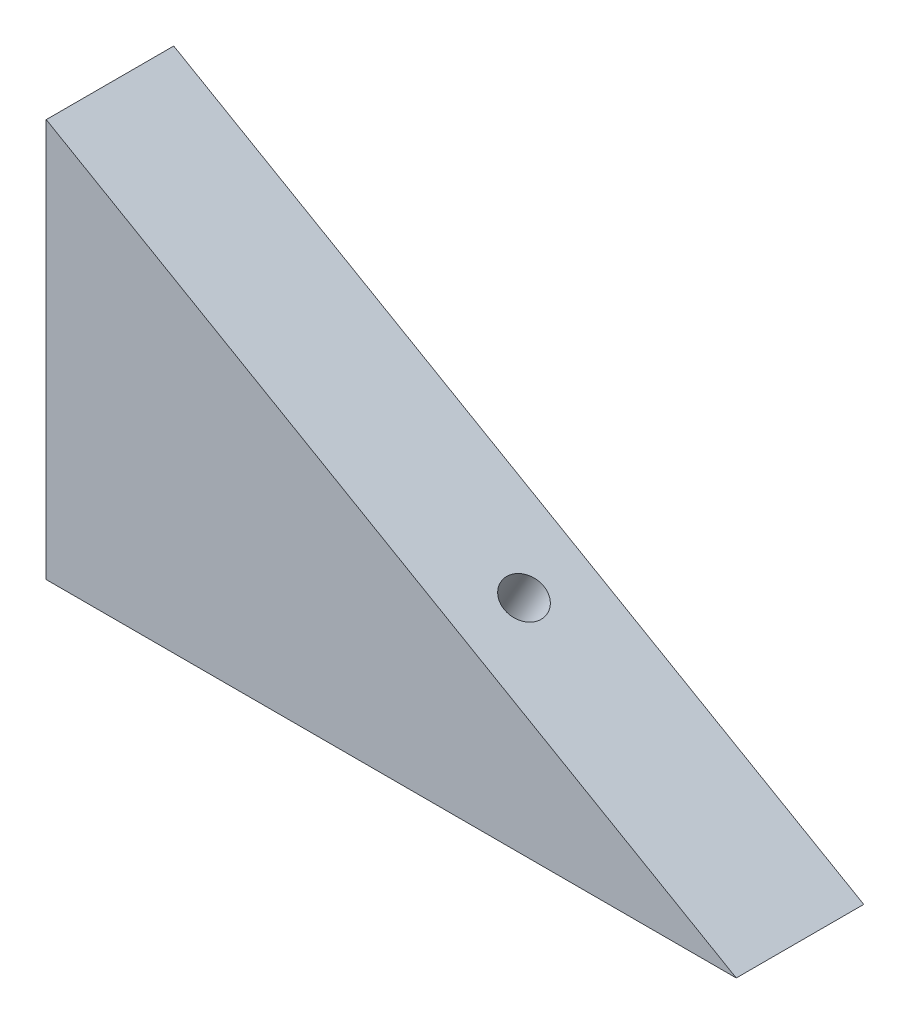
ISO-10303-21;
HEADER;
FILE_DESCRIPTION(('STEP AP214'),'2;1');
FILE_NAME('part.step','',(''),(''),'','','');
FILE_SCHEMA(('AUTOMOTIVE_DESIGN { 1 0 10303 214 1 1 1 1 }'));
ENDSEC;
DATA;
#1=APPLICATION_CONTEXT('core data for automotive mechanical design processes');
#2=APPLICATION_PROTOCOL_DEFINITION('international standard','automotive_design',2000,#1);
#3=PRODUCT_CONTEXT('',#1,'mechanical');
#4=PRODUCT('Part','Part','',(#3));
#5=PRODUCT_RELATED_PRODUCT_CATEGORY('part','',(#4));
#6=PRODUCT_DEFINITION_FORMATION('','',#4);
#7=PRODUCT_DEFINITION_CONTEXT('part definition',#1,'design');
#8=PRODUCT_DEFINITION('design','',#6,#7);
#9=PRODUCT_DEFINITION_SHAPE('','',#8);
#10=(LENGTH_UNIT() NAMED_UNIT(*) SI_UNIT(.MILLI.,.METRE.));
#11=(NAMED_UNIT(*) PLANE_ANGLE_UNIT() SI_UNIT($,.RADIAN.));
#12=(NAMED_UNIT(*) SI_UNIT($,.STERADIAN.) SOLID_ANGLE_UNIT());
#13=UNCERTAINTY_MEASURE_WITH_UNIT(LENGTH_MEASURE(1.E-05),#10,'distance_accuracy_value','');
#14=(GEOMETRIC_REPRESENTATION_CONTEXT(3) GLOBAL_UNCERTAINTY_ASSIGNED_CONTEXT((#13)) GLOBAL_UNIT_ASSIGNED_CONTEXT((#10,
#11,#12)) REPRESENTATION_CONTEXT('',''));
#15=CARTESIAN_POINT('',(0.,0.,0.));
#16=DIRECTION('',(0.,0.,1.));
#17=DIRECTION('',(1.,0.,0.));
#18=AXIS2_PLACEMENT_3D('',#15,#16,#17);
#19=CARTESIAN_POINT('',(0.998275489171607,-32.2358475927408,8.));
#20=DIRECTION('',(-0.500000000000004,-0.866025403784436,0.));
#21=DIRECTION('',(0.866025403784436,-0.500000000000004,0.));
#22=AXIS2_PLACEMENT_3D('',#19,#20,#21);
#23=PLANE('',#22);
#24=CARTESIAN_POINT('',(-16.3222325865171,-22.2358475927408,4.));
#25=DIRECTION('',(0.500000000000004,0.866025403784436,0.));
#26=DIRECTION('',(-0.866025403784436,0.500000000000004,0.));
#27=AXIS2_PLACEMENT_3D('',#24,#25,#26);
#28=CIRCLE('',#27,1.24999999999999);
#29=CARTESIAN_POINT('',(-17.4047643412477,-21.6108475927408,4.));
#30=VERTEX_POINT('',#29);
#31=EDGE_CURVE('E120',#30,#30,#28,.T.);
#32=ORIENTED_EDGE('',*,*,#31,.F.);
#33=EDGE_LOOP('',(#32));
#34=FACE_BOUND('',#33,.T.);
#35=DIRECTION('',(-0.866025403784436,0.500000000000004,0.));
#36=VECTOR('',#35,1.);
#37=CARTESIAN_POINT('',(0.998275489171607,-32.2358475927408,0.));
#38=LINE('',#37,#36);
#39=CARTESIAN_POINT('',(0.998275489171607,-32.2358475927408,0.));
#40=VERTEX_POINT('',#39);
#41=CARTESIAN_POINT('',(-42.3029947000499,-7.23584759274083,0.));
#42=VERTEX_POINT('',#41);
#43=EDGE_CURVE('E86',#40,#42,#38,.T.);
#44=ORIENTED_EDGE('',*,*,#43,.T.);
#45=DIRECTION('',(0.,0.,-1.));
#46=VECTOR('',#45,1.);
#47=CARTESIAN_POINT('',(-42.3029947000499,-7.23584759274083,8.));
#48=LINE('',#47,#46);
#49=CARTESIAN_POINT('',(-42.3029947000499,-7.23584759274083,8.));
#50=VERTEX_POINT('',#49);
#51=EDGE_CURVE('E11',#50,#42,#48,.T.);
#52=ORIENTED_EDGE('',*,*,#51,.F.);
#53=DIRECTION('',(-0.866025403784436,0.500000000000004,0.));
#54=VECTOR('',#53,1.);
#55=CARTESIAN_POINT('',(0.998275489171607,-32.2358475927408,8.));
#56=LINE('',#55,#54);
#57=CARTESIAN_POINT('',(0.998275489171607,-32.2358475927408,8.));
#58=VERTEX_POINT('',#57);
#59=EDGE_CURVE('E79',#58,#50,#56,.T.);
#60=ORIENTED_EDGE('',*,*,#59,.F.);
#61=DIRECTION('',(0.,0.,-1.));
#62=VECTOR('',#61,1.);
#63=CARTESIAN_POINT('',(0.998275489171607,-32.2358475927408,8.));
#64=LINE('',#63,#62);
#65=EDGE_CURVE('E87',#58,#40,#64,.T.);
#66=ORIENTED_EDGE('',*,*,#65,.T.);
#67=EDGE_LOOP('',(#44,#52,#60,#66));
#68=FACE_BOUND('',#67,.T.);
#69=ADVANCED_FACE('F39',(#34,#68),#23,.F.);
#70=CARTESIAN_POINT('',(-42.3029947000499,-7.23584759274083,8.));
#71=DIRECTION('',(1.,0.,0.));
#72=DIRECTION('',(0.,0.,-1.));
#73=AXIS2_PLACEMENT_3D('',#70,#71,#72);
#74=PLANE('',#73);
#75=CARTESIAN_POINT('',(-42.3029947000499,-22.2358475927408,4.));
#76=DIRECTION('',(-1.,0.,0.));
#77=DIRECTION('',(0.,0.,1.));
#78=AXIS2_PLACEMENT_3D('',#75,#76,#77);
#79=CIRCLE('',#78,1.24999999999999);
#80=CARTESIAN_POINT('',(-42.3029947000499,-22.2358475927408,5.24999999999999));
#81=VERTEX_POINT('',#80);
#82=EDGE_CURVE('E93',#81,#81,#79,.T.);
#83=ORIENTED_EDGE('',*,*,#82,.F.);
#84=EDGE_LOOP('',(#83));
#85=FACE_BOUND('',#84,.T.);
#86=DIRECTION('',(0.,-1.,0.));
#87=VECTOR('',#86,1.);
#88=CARTESIAN_POINT('',(-42.3029947000499,-7.23584759274083,0.));
#89=LINE('',#88,#87);
#90=CARTESIAN_POINT('',(-42.3029947000499,-32.2358475927408,0.));
#91=VERTEX_POINT('',#90);
#92=EDGE_CURVE('E67',#42,#91,#89,.T.);
#93=ORIENTED_EDGE('',*,*,#92,.T.);
#94=DIRECTION('',(0.,0.,-1.));
#95=VECTOR('',#94,1.);
#96=CARTESIAN_POINT('',(-42.3029947000499,-32.2358475927408,8.));
#97=LINE('',#96,#95);
#98=CARTESIAN_POINT('',(-42.3029947000499,-32.2358475927408,8.));
#99=VERTEX_POINT('',#98);
#100=EDGE_CURVE('E47',#99,#91,#97,.T.);
#101=ORIENTED_EDGE('',*,*,#100,.F.);
#102=DIRECTION('',(0.,-1.,0.));
#103=VECTOR('',#102,1.);
#104=CARTESIAN_POINT('',(-42.3029947000499,-7.23584759274083,8.));
#105=LINE('',#104,#103);
#106=EDGE_CURVE('E75',#50,#99,#105,.T.);
#107=ORIENTED_EDGE('',*,*,#106,.F.);
#108=ORIENTED_EDGE('',*,*,#51,.T.);
#109=EDGE_LOOP('',(#93,#101,#107,#108));
#110=FACE_BOUND('',#109,.T.);
#111=ADVANCED_FACE('F76',(#85,#110),#74,.F.);
#112=CARTESIAN_POINT('',(-42.3029947000499,-32.2358475927408,8.));
#113=DIRECTION('',(0.,1.,0.));
#114=DIRECTION('',(0.,0.,1.));
#115=AXIS2_PLACEMENT_3D('',#112,#113,#114);
#116=PLANE('',#115);
#117=DIRECTION('',(1.,0.,0.));
#118=VECTOR('',#117,1.);
#119=CARTESIAN_POINT('',(-42.3029947000499,-32.2358475927408,0.));
#120=LINE('',#119,#118);
#121=EDGE_CURVE('E72',#91,#40,#120,.T.);
#122=ORIENTED_EDGE('',*,*,#121,.T.);
#123=ORIENTED_EDGE('',*,*,#65,.F.);
#124=DIRECTION('',(1.,0.,0.));
#125=VECTOR('',#124,1.);
#126=CARTESIAN_POINT('',(-42.3029947000499,-32.2358475927408,8.));
#127=LINE('',#126,#125);
#128=EDGE_CURVE('E55',#99,#58,#127,.T.);
#129=ORIENTED_EDGE('',*,*,#128,.F.);
#130=ORIENTED_EDGE('',*,*,#100,.T.);
#131=EDGE_LOOP('',(#122,#123,#129,#130));
#132=FACE_BOUND('',#131,.T.);
#133=ADVANCED_FACE('F98',(#132),#116,.F.);
#134=CARTESIAN_POINT('',(0.,0.,8.));
#135=DIRECTION('',(0.,0.,1.));
#136=DIRECTION('',(1.,0.,0.));
#137=AXIS2_PLACEMENT_3D('',#134,#135,#136);
#138=PLANE('',#137);
#139=ORIENTED_EDGE('',*,*,#59,.T.);
#140=ORIENTED_EDGE('',*,*,#106,.T.);
#141=ORIENTED_EDGE('',*,*,#128,.T.);
#142=EDGE_LOOP('',(#139,#140,#141));
#143=FACE_BOUND('',#142,.T.);
#144=ADVANCED_FACE('F82',(#143),#138,.T.);
#145=CARTESIAN_POINT('',(0.,0.,0.));
#146=DIRECTION('',(0.,0.,1.));
#147=DIRECTION('',(1.,0.,0.));
#148=AXIS2_PLACEMENT_3D('',#145,#146,#147);
#149=PLANE('',#148);
#150=ORIENTED_EDGE('',*,*,#43,.F.);
#151=ORIENTED_EDGE('',*,*,#121,.F.);
#152=ORIENTED_EDGE('',*,*,#92,.F.);
#153=EDGE_LOOP('',(#150,#151,#152));
#154=FACE_BOUND('',#153,.T.);
#155=ADVANCED_FACE('F99',(#154),#149,.F.);
#156=CARTESIAN_POINT('',(-37.3029947000499,-22.2358475927408,4.));
#157=DIRECTION('',(1.,0.,0.));
#158=DIRECTION('',(0.,0.,-1.));
#159=AXIS2_PLACEMENT_3D('',#156,#157,#158);
#160=PLANE('',#159);
#161=CARTESIAN_POINT('',(-37.3029947000499,-22.2358475927408,4.));
#162=DIRECTION('',(-1.,0.,0.));
#163=DIRECTION('',(0.,0.,1.));
#164=AXIS2_PLACEMENT_3D('',#161,#162,#163);
#165=CIRCLE('',#164,1.25);
#166=CARTESIAN_POINT('',(-37.3029947000499,-22.2358475927408,5.25));
#167=VERTEX_POINT('',#166);
#168=EDGE_CURVE('E89',#167,#167,#165,.T.);
#169=ORIENTED_EDGE('',*,*,#168,.T.);
#170=EDGE_LOOP('',(#169));
#171=FACE_BOUND('',#170,.T.);
#172=ADVANCED_FACE('F101',(#171),#160,.F.);
#173=CARTESIAN_POINT('',(-42.3029947000499,-22.2358475927408,4.));
#174=DIRECTION('',(-1.,0.,0.));
#175=DIRECTION('',(0.,0.,1.));
#176=AXIS2_PLACEMENT_3D('',#173,#174,#175);
#177=CYLINDRICAL_SURFACE('',#176,1.24999999999999);
#178=ORIENTED_EDGE('',*,*,#168,.F.);
#179=EDGE_LOOP('',(#178));
#180=FACE_BOUND('',#179,.T.);
#181=ORIENTED_EDGE('',*,*,#82,.T.);
#182=EDGE_LOOP('',(#181));
#183=FACE_BOUND('',#182,.T.);
#184=ADVANCED_FACE('F107',(#180,#183),#177,.F.);
#185=CARTESIAN_POINT('',(-18.8222325865171,-26.5659746116629,4.));
#186=DIRECTION('',(-0.500000000000004,-0.866025403784436,0.));
#187=DIRECTION('',(0.866025403784436,-0.500000000000004,0.));
#188=AXIS2_PLACEMENT_3D('',#185,#186,#187);
#189=PLANE('',#188);
#190=CARTESIAN_POINT('',(-18.8222325865171,-26.5659746116629,4.));
#191=DIRECTION('',(0.500000000000004,0.866025403784436,0.));
#192=DIRECTION('',(-0.866025403784436,0.500000000000004,0.));
#193=AXIS2_PLACEMENT_3D('',#190,#191,#192);
#194=CIRCLE('',#193,1.25);
#195=CARTESIAN_POINT('',(-19.9047643412477,-25.9409746116629,4.));
#196=VERTEX_POINT('',#195);
#197=EDGE_CURVE('E122',#196,#196,#194,.T.);
#198=ORIENTED_EDGE('',*,*,#197,.T.);
#199=EDGE_LOOP('',(#198));
#200=FACE_BOUND('',#199,.T.);
#201=ADVANCED_FACE('F131',(#200),#189,.F.);
#202=CARTESIAN_POINT('',(-16.3222325865171,-22.2358475927408,4.));
#203=DIRECTION('',(0.500000000000004,0.866025403784436,0.));
#204=DIRECTION('',(-0.866025403784436,0.500000000000004,0.));
#205=AXIS2_PLACEMENT_3D('',#202,#203,#204);
#206=CYLINDRICAL_SURFACE('',#205,1.24999999999999);
#207=CARTESIAN_POINT('',(-19.9047643412477,-25.9409746116629,4.));
#208=CARTESIAN_POINT('',(-19.878722674581,-25.8958691218825,4.));
#209=CARTESIAN_POINT('',(-19.8526810079143,-25.8507636321021,4.));
#210=CARTESIAN_POINT('',(-19.800597674581,-25.7605526525412,4.));
#211=CARTESIAN_POINT('',(-19.7745560079143,-25.7154471627607,4.));
#212=CARTESIAN_POINT('',(-19.722472674581,-25.6252361831999,4.));
#213=CARTESIAN_POINT('',(-19.6964310079143,-25.5801306934194,4.));
#214=CARTESIAN_POINT('',(-19.644347674581,-25.4899197138585,4.));
#215=CARTESIAN_POINT('',(-19.6183060079143,-25.4448142240781,4.));
#216=CARTESIAN_POINT('',(-19.566222674581,-25.3546032445172,4.));
#217=CARTESIAN_POINT('',(-19.5401810079143,-25.3094977547368,4.));
#218=CARTESIAN_POINT('',(-19.488097674581,-25.2192867751759,4.));
#219=CARTESIAN_POINT('',(-19.4620560079143,-25.1741812853955,4.));
#220=CARTESIAN_POINT('',(-19.409972674581,-25.0839703058346,4.));
#221=CARTESIAN_POINT('',(-19.3839310079143,-25.0388648160541,4.));
#222=CARTESIAN_POINT('',(-19.331847674581,-24.9486538364933,4.));
#223=CARTESIAN_POINT('',(-19.3058060079143,-24.9035483467128,4.));
#224=CARTESIAN_POINT('',(-19.253722674581,-24.813337367152,4.));
#225=CARTESIAN_POINT('',(-19.2276810079143,-24.7682318773715,4.));
#226=CARTESIAN_POINT('',(-19.175597674581,-24.6780208978106,4.));
#227=CARTESIAN_POINT('',(-19.1495560079143,-24.6329154080302,4.));
#228=CARTESIAN_POINT('',(-19.097472674581,-24.5427044284693,4.));
#229=CARTESIAN_POINT('',(-19.0714310079143,-24.4975989386889,4.));
#230=CARTESIAN_POINT('',(-19.019347674581,-24.407387959128,4.));
#231=CARTESIAN_POINT('',(-18.9933060079143,-24.3622824693476,4.));
#232=CARTESIAN_POINT('',(-18.941222674581,-24.2720714897867,4.));
#233=CARTESIAN_POINT('',(-18.9151810079143,-24.2269660000062,4.));
#234=CARTESIAN_POINT('',(-18.863097674581,-24.1367550204454,4.));
#235=CARTESIAN_POINT('',(-18.8370560079143,-24.0916495306649,4.));
#236=CARTESIAN_POINT('',(-18.784972674581,-24.001438551104,4.));
#237=CARTESIAN_POINT('',(-18.7589310079143,-23.9563330613236,4.));
#238=CARTESIAN_POINT('',(-18.706847674581,-23.8661220817627,4.));
#239=CARTESIAN_POINT('',(-18.6808060079143,-23.8210165919823,4.));
#240=CARTESIAN_POINT('',(-18.628722674581,-23.7308056124214,4.));
#241=CARTESIAN_POINT('',(-18.6026810079143,-23.685700122641,4.));
#242=CARTESIAN_POINT('',(-18.550597674581,-23.5954891430801,4.));
#243=CARTESIAN_POINT('',(-18.5245560079143,-23.5503836532996,4.));
#244=CARTESIAN_POINT('',(-18.472472674581,-23.4601726737388,4.));
#245=CARTESIAN_POINT('',(-18.4464310079143,-23.4150671839583,4.));
#246=CARTESIAN_POINT('',(-18.394347674581,-23.3248562043975,4.));
#247=CARTESIAN_POINT('',(-18.3683060079143,-23.279750714617,4.));
#248=CARTESIAN_POINT('',(-18.316222674581,-23.1895397350561,4.));
#249=CARTESIAN_POINT('',(-18.2901810079143,-23.1444342452757,4.));
#250=CARTESIAN_POINT('',(-18.238097674581,-23.0542232657148,4.));
#251=CARTESIAN_POINT('',(-18.2120560079143,-23.0091177759344,4.));
#252=CARTESIAN_POINT('',(-18.159972674581,-22.9189067963735,4.));
#253=CARTESIAN_POINT('',(-18.1339310079143,-22.8738013065931,4.));
#254=CARTESIAN_POINT('',(-18.081847674581,-22.7835903270322,4.));
#255=CARTESIAN_POINT('',(-18.0558060079143,-22.7384848372517,4.));
#256=CARTESIAN_POINT('',(-18.003722674581,-22.6482738576909,4.));
#257=CARTESIAN_POINT('',(-17.9776810079143,-22.6031683679104,4.));
#258=CARTESIAN_POINT('',(-17.925597674581,-22.5129573883495,4.));
#259=CARTESIAN_POINT('',(-17.8995560079143,-22.4678518985691,4.));
#260=CARTESIAN_POINT('',(-17.847472674581,-22.3776409190082,4.));
#261=CARTESIAN_POINT('',(-17.8214310079143,-22.3325354292278,4.));
#262=CARTESIAN_POINT('',(-17.769347674581,-22.2423244496669,4.));
#263=CARTESIAN_POINT('',(-17.7433060079143,-22.1972189598865,4.));
#264=CARTESIAN_POINT('',(-17.691222674581,-22.1070079803256,4.));
#265=CARTESIAN_POINT('',(-17.6651810079143,-22.0619024905451,4.));
#266=CARTESIAN_POINT('',(-17.613097674581,-21.9716915109843,4.));
#267=CARTESIAN_POINT('',(-17.5870560079143,-21.9265860212038,4.));
#268=CARTESIAN_POINT('',(-17.534972674581,-21.836375041643,4.));
#269=CARTESIAN_POINT('',(-17.5089310079143,-21.7912695518625,4.));
#270=CARTESIAN_POINT('',(-17.456847674581,-21.7010585723016,4.));
#271=CARTESIAN_POINT('',(-17.4308060079143,-21.6559530825212,4.));
#272=CARTESIAN_POINT('',(-17.4047643412477,-21.6108475927408,4.));
#273=B_SPLINE_CURVE_WITH_KNOTS('',3,(#207,#208,#209,#210,#211,#212,#213,#214,#215,#216,#217,
#218,#219,#220,#221,#222,#223,#224,#225,#226,#227,#228,#229,#230,#231,#232,#233,#234,#235,#236,
#237,#238,#239,#240,#241,#242,#243,#244,#245,#246,#247,#248,#249,#250,#251,#252,#253,#254,#255,
#256,#257,#258,#259,#260,#261,#262,#263,#264,#265,#266,#267,#268,#269,#270,#271,#272),
.UNSPECIFIED.,.F.,.F.,(4,2,2,2,2,2,2,2,2,2,2,2,2,2,2,2,2,2,2,2,2,2,2,2,2,2,2,2,2,2,2,2,4),(0.,
0.156250000000001,0.312500000000003,0.468750000000001,0.625000000000001,0.781250000000003,
0.937500000000004,1.09375,1.25,1.40625,1.5625,1.71875,1.875,2.03125,2.1875,2.34375,2.5,2.65625,
2.8125,2.96875,3.125,3.28125,3.4375,3.59375,3.75,3.90625,4.0625,4.21875000000001,
4.37500000000001,4.53125,4.68750000000001,4.84375000000001,5.),.UNSPECIFIED.);
#274=EDGE_CURVE('BSEAM137',#196,#30,#273,.T.);
#275=ORIENTED_EDGE('',*,*,#197,.F.);
#276=ORIENTED_EDGE('',*,*,#31,.T.);
#277=ORIENTED_EDGE('',*,*,#274,.T.);
#278=ORIENTED_EDGE('',*,*,#274,.F.);
#279=EDGE_LOOP('',(#275,#277,#276,#278));
#280=FACE_BOUND('',#279,.T.);
#281=ADVANCED_FACE('F137',(#280),#206,.F.);
#282=CLOSED_SHELL('',(#69,#111,#133,#144,#155,#172,#184,#201,#281));
#283=MANIFOLD_SOLID_BREP('B2',#282);
#284=ADVANCED_BREP_SHAPE_REPRESENTATION('',(#18,#283),#14);
#285=SHAPE_DEFINITION_REPRESENTATION(#9,#284);
ENDSEC;
END-ISO-10303-21;
